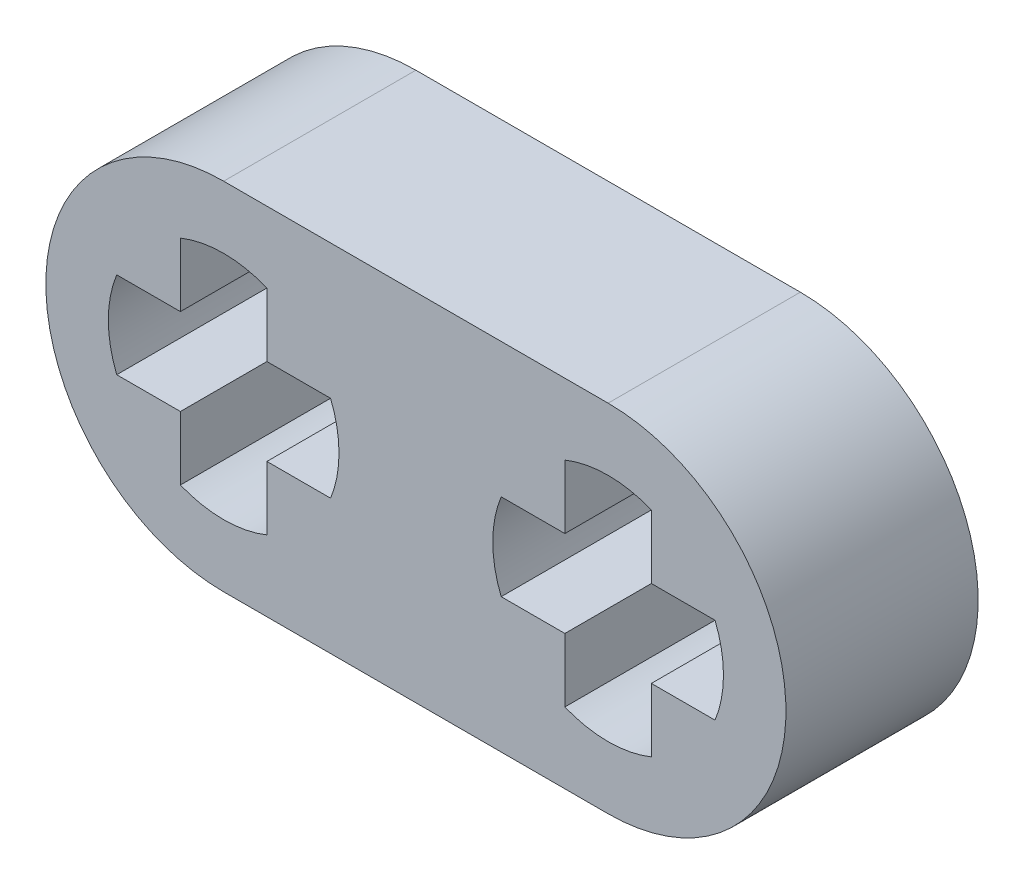
ISO-10303-21;
HEADER;
FILE_DESCRIPTION(('STEP AP214'),'2;1');
FILE_NAME('part.step','',(''),(''),'','','');
FILE_SCHEMA(('AUTOMOTIVE_DESIGN { 1 0 10303 214 1 1 1 1 }'));
ENDSEC;
DATA;
#1=APPLICATION_CONTEXT('core data for automotive mechanical design processes');
#2=APPLICATION_PROTOCOL_DEFINITION('international standard','automotive_design',2000,#1);
#3=PRODUCT_CONTEXT('',#1,'mechanical');
#4=PRODUCT('Part','Part','',(#3));
#5=PRODUCT_RELATED_PRODUCT_CATEGORY('part','',(#4));
#6=PRODUCT_DEFINITION_FORMATION('','',#4);
#7=PRODUCT_DEFINITION_CONTEXT('part definition',#1,'design');
#8=PRODUCT_DEFINITION('design','',#6,#7);
#9=PRODUCT_DEFINITION_SHAPE('','',#8);
#10=(LENGTH_UNIT() NAMED_UNIT(*) SI_UNIT(.MILLI.,.METRE.));
#11=(NAMED_UNIT(*) PLANE_ANGLE_UNIT() SI_UNIT($,.RADIAN.));
#12=(NAMED_UNIT(*) SI_UNIT($,.STERADIAN.) SOLID_ANGLE_UNIT());
#13=UNCERTAINTY_MEASURE_WITH_UNIT(LENGTH_MEASURE(1.E-05),#10,'distance_accuracy_value','');
#14=(GEOMETRIC_REPRESENTATION_CONTEXT(3) GLOBAL_UNCERTAINTY_ASSIGNED_CONTEXT((#13)) GLOBAL_UNIT_ASSIGNED_CONTEXT((#10,
#11,#12)) REPRESENTATION_CONTEXT('',''));
#15=CARTESIAN_POINT('',(0.,0.,0.));
#16=DIRECTION('',(0.,0.,1.));
#17=DIRECTION('',(1.,0.,0.));
#18=AXIS2_PLACEMENT_3D('',#15,#16,#17);
#19=CARTESIAN_POINT('',(0.,3.7,2.));
#20=DIRECTION('',(0.,-1.,0.));
#21=DIRECTION('',(1.,0.,0.));
#22=AXIS2_PLACEMENT_3D('',#19,#20,#21);
#23=PLANE('',#22);
#24=DIRECTION('',(-1.,0.,0.));
#25=VECTOR('',#24,1.);
#26=CARTESIAN_POINT('',(0.,3.7,-2.));
#27=LINE('',#26,#25);
#28=CARTESIAN_POINT('',(4.,3.7,-2.));
#29=VERTEX_POINT('',#28);
#30=CARTESIAN_POINT('',(-4.,3.7,-2.));
#31=VERTEX_POINT('',#30);
#32=EDGE_CURVE('E314',#29,#31,#27,.T.);
#33=ORIENTED_EDGE('',*,*,#32,.T.);
#34=DIRECTION('',(0.,0.,-1.));
#35=VECTOR('',#34,1.);
#36=CARTESIAN_POINT('',(-4.,3.7,2.));
#37=LINE('',#36,#35);
#38=CARTESIAN_POINT('',(-4.,3.7,2.));
#39=VERTEX_POINT('',#38);
#40=EDGE_CURVE('E11',#39,#31,#37,.T.);
#41=ORIENTED_EDGE('',*,*,#40,.F.);
#42=DIRECTION('',(-1.,0.,0.));
#43=VECTOR('',#42,1.);
#44=CARTESIAN_POINT('',(0.,3.7,2.));
#45=LINE('',#44,#43);
#46=CARTESIAN_POINT('',(4.,3.7,2.));
#47=VERTEX_POINT('',#46);
#48=EDGE_CURVE('E231',#47,#39,#45,.T.);
#49=ORIENTED_EDGE('',*,*,#48,.F.);
#50=DIRECTION('',(0.,0.,-1.));
#51=VECTOR('',#50,1.);
#52=CARTESIAN_POINT('',(4.,3.7,2.));
#53=LINE('',#52,#51);
#54=EDGE_CURVE('E322',#47,#29,#53,.T.);
#55=ORIENTED_EDGE('',*,*,#54,.T.);
#56=EDGE_LOOP('',(#33,#41,#49,#55));
#57=FACE_BOUND('',#56,.T.);
#58=ADVANCED_FACE('F34',(#57),#23,.F.);
#59=CARTESIAN_POINT('',(-4.,0.,2.));
#60=DIRECTION('',(0.,0.,-1.));
#61=DIRECTION('',(-1.,0.,0.));
#62=AXIS2_PLACEMENT_3D('',#59,#60,#61);
#63=CYLINDRICAL_SURFACE('',#62,3.7);
#64=CARTESIAN_POINT('',(-4.,0.,-2.));
#65=DIRECTION('',(0.,0.,1.));
#66=DIRECTION('',(1.,0.,0.));
#67=AXIS2_PLACEMENT_3D('',#64,#65,#66);
#68=CIRCLE('',#67,3.7);
#69=CARTESIAN_POINT('',(-4.,-3.7,-2.));
#70=VERTEX_POINT('',#69);
#71=EDGE_CURVE('E237',#31,#70,#68,.T.);
#72=ORIENTED_EDGE('',*,*,#71,.T.);
#73=DIRECTION('',(0.,0.,-1.));
#74=VECTOR('',#73,1.);
#75=CARTESIAN_POINT('',(-4.,-3.7,2.));
#76=LINE('',#75,#74);
#77=CARTESIAN_POINT('',(-4.,-3.7,2.));
#78=VERTEX_POINT('',#77);
#79=EDGE_CURVE('E44',#78,#70,#76,.T.);
#80=ORIENTED_EDGE('',*,*,#79,.F.);
#81=CARTESIAN_POINT('',(-4.,0.,2.));
#82=DIRECTION('',(0.,0.,1.));
#83=DIRECTION('',(1.,0.,0.));
#84=AXIS2_PLACEMENT_3D('',#81,#82,#83);
#85=CIRCLE('',#84,3.7);
#86=EDGE_CURVE('E225',#39,#78,#85,.T.);
#87=ORIENTED_EDGE('',*,*,#86,.F.);
#88=ORIENTED_EDGE('',*,*,#40,.T.);
#89=EDGE_LOOP('',(#72,#80,#87,#88));
#90=FACE_BOUND('',#89,.T.);
#91=ADVANCED_FACE('F236',(#90),#63,.T.);
#92=CARTESIAN_POINT('',(0.,-3.7,2.));
#93=DIRECTION('',(0.,-1.,0.));
#94=DIRECTION('',(1.,0.,0.));
#95=AXIS2_PLACEMENT_3D('',#92,#93,#94);
#96=PLANE('',#95);
#97=DIRECTION('',(-1.,0.,0.));
#98=VECTOR('',#97,1.);
#99=CARTESIAN_POINT('',(0.,-3.7,-2.));
#100=LINE('',#99,#98);
#101=CARTESIAN_POINT('',(4.,-3.7,-2.));
#102=VERTEX_POINT('',#101);
#103=EDGE_CURVE('E318',#102,#70,#100,.T.);
#104=ORIENTED_EDGE('',*,*,#103,.F.);
#105=DIRECTION('',(0.,0.,-1.));
#106=VECTOR('',#105,1.);
#107=CARTESIAN_POINT('',(4.,-3.7,2.));
#108=LINE('',#107,#106);
#109=CARTESIAN_POINT('',(4.,-3.7,2.));
#110=VERTEX_POINT('',#109);
#111=EDGE_CURVE('E141',#110,#102,#108,.T.);
#112=ORIENTED_EDGE('',*,*,#111,.F.);
#113=DIRECTION('',(-1.,0.,0.));
#114=VECTOR('',#113,1.);
#115=CARTESIAN_POINT('',(0.,-3.7,2.));
#116=LINE('',#115,#114);
#117=EDGE_CURVE('E229',#110,#78,#116,.T.);
#118=ORIENTED_EDGE('',*,*,#117,.T.);
#119=ORIENTED_EDGE('',*,*,#79,.T.);
#120=EDGE_LOOP('',(#104,#112,#118,#119));
#121=FACE_BOUND('',#120,.T.);
#122=ADVANCED_FACE('F242',(#121),#96,.T.);
#123=CARTESIAN_POINT('',(-4.,0.,2.));
#124=DIRECTION('',(0.,0.,-1.));
#125=DIRECTION('',(-1.,0.,0.));
#126=AXIS2_PLACEMENT_3D('',#123,#124,#125);
#127=CYLINDRICAL_SURFACE('',#126,2.4);
#128=CARTESIAN_POINT('',(-4.,0.,-2.));
#129=DIRECTION('',(0.,0.,1.));
#130=DIRECTION('',(1.,0.,0.));
#131=AXIS2_PLACEMENT_3D('',#128,#129,#130);
#132=CIRCLE('',#131,2.4);
#133=CARTESIAN_POINT('',(-1.7751404538713,0.900000000000001,-2.));
#134=VERTEX_POINT('',#133);
#135=CARTESIAN_POINT('',(-1.7751404538713,-0.899999999999999,-2.));
#136=VERTEX_POINT('',#135);
#137=EDGE_CURVE('E283',#134,#136,#132,.F.);
#138=ORIENTED_EDGE('',*,*,#137,.T.);
#139=DIRECTION('',(0.,0.,-1.));
#140=VECTOR('',#139,1.);
#141=CARTESIAN_POINT('',(-1.7751404538713,-0.899999999999999,2.));
#142=LINE('',#141,#140);
#143=CARTESIAN_POINT('',(-1.7751404538713,-0.899999999999999,2.));
#144=VERTEX_POINT('',#143);
#145=EDGE_CURVE('E324',#144,#136,#142,.T.);
#146=ORIENTED_EDGE('',*,*,#145,.F.);
#147=CARTESIAN_POINT('',(-4.,0.,2.));
#148=DIRECTION('',(0.,0.,1.));
#149=DIRECTION('',(1.,0.,0.));
#150=AXIS2_PLACEMENT_3D('',#147,#148,#149);
#151=CIRCLE('',#150,2.4);
#152=CARTESIAN_POINT('',(-1.7751404538713,0.900000000000001,2.));
#153=VERTEX_POINT('',#152);
#154=EDGE_CURVE('E425',#153,#144,#151,.F.);
#155=ORIENTED_EDGE('',*,*,#154,.F.);
#156=DIRECTION('',(0.,0.,-1.));
#157=VECTOR('',#156,1.);
#158=CARTESIAN_POINT('',(-1.7751404538713,0.900000000000001,2.));
#159=LINE('',#158,#157);
#160=EDGE_CURVE('E326',#153,#134,#159,.T.);
#161=ORIENTED_EDGE('',*,*,#160,.T.);
#162=EDGE_LOOP('',(#138,#146,#155,#161));
#163=FACE_BOUND('',#162,.T.);
#164=ADVANCED_FACE('F463',(#163),#127,.F.);
#165=CARTESIAN_POINT('',(0.,-0.899999999999999,2.));
#166=DIRECTION('',(0.,1.,0.));
#167=DIRECTION('',(-1.,0.,0.));
#168=AXIS2_PLACEMENT_3D('',#165,#166,#167);
#169=PLANE('',#168);
#170=DIRECTION('',(1.,0.,0.));
#171=VECTOR('',#170,1.);
#172=CARTESIAN_POINT('',(0.,-0.899999999999999,-2.));
#173=LINE('',#172,#171);
#174=CARTESIAN_POINT('',(-3.1,-0.9,-2.));
#175=VERTEX_POINT('',#174);
#176=EDGE_CURVE('E286',#175,#136,#173,.T.);
#177=ORIENTED_EDGE('',*,*,#176,.F.);
#178=DIRECTION('',(0.,0.,-1.));
#179=VECTOR('',#178,1.);
#180=CARTESIAN_POINT('',(-3.1,-0.9,2.));
#181=LINE('',#180,#179);
#182=CARTESIAN_POINT('',(-3.1,-0.9,2.));
#183=VERTEX_POINT('',#182);
#184=EDGE_CURVE('E351',#183,#175,#181,.T.);
#185=ORIENTED_EDGE('',*,*,#184,.F.);
#186=DIRECTION('',(1.,0.,0.));
#187=VECTOR('',#186,1.);
#188=CARTESIAN_POINT('',(0.,-0.899999999999999,2.));
#189=LINE('',#188,#187);
#190=EDGE_CURVE('E427',#183,#144,#189,.T.);
#191=ORIENTED_EDGE('',*,*,#190,.T.);
#192=ORIENTED_EDGE('',*,*,#145,.T.);
#193=EDGE_LOOP('',(#177,#185,#191,#192));
#194=FACE_BOUND('',#193,.T.);
#195=ADVANCED_FACE('F466',(#194),#169,.T.);
#196=CARTESIAN_POINT('',(-3.1,0.,2.));
#197=DIRECTION('',(-1.,0.,0.));
#198=DIRECTION('',(0.,-1.,0.));
#199=AXIS2_PLACEMENT_3D('',#196,#197,#198);
#200=PLANE('',#199);
#201=DIRECTION('',(0.,1.,0.));
#202=VECTOR('',#201,1.);
#203=CARTESIAN_POINT('',(-3.1,0.,-2.));
#204=LINE('',#203,#202);
#205=CARTESIAN_POINT('',(-3.1,-2.2248595461287,-2.));
#206=VERTEX_POINT('',#205);
#207=EDGE_CURVE('E289',#206,#175,#204,.T.);
#208=ORIENTED_EDGE('',*,*,#207,.F.);
#209=DIRECTION('',(0.,0.,-1.));
#210=VECTOR('',#209,1.);
#211=CARTESIAN_POINT('',(-3.1,-2.2248595461287,2.));
#212=LINE('',#211,#210);
#213=CARTESIAN_POINT('',(-3.1,-2.2248595461287,2.));
#214=VERTEX_POINT('',#213);
#215=EDGE_CURVE('E349',#214,#206,#212,.T.);
#216=ORIENTED_EDGE('',*,*,#215,.F.);
#217=DIRECTION('',(0.,1.,0.));
#218=VECTOR('',#217,1.);
#219=CARTESIAN_POINT('',(-3.1,0.,2.));
#220=LINE('',#219,#218);
#221=EDGE_CURVE('E430',#214,#183,#220,.T.);
#222=ORIENTED_EDGE('',*,*,#221,.T.);
#223=ORIENTED_EDGE('',*,*,#184,.T.);
#224=EDGE_LOOP('',(#208,#216,#222,#223));
#225=FACE_BOUND('',#224,.T.);
#226=ADVANCED_FACE('F470',(#225),#200,.T.);
#227=CARTESIAN_POINT('',(-4.,0.,2.));
#228=DIRECTION('',(0.,0.,-1.));
#229=DIRECTION('',(-1.,0.,0.));
#230=AXIS2_PLACEMENT_3D('',#227,#228,#229);
#231=CYLINDRICAL_SURFACE('',#230,2.4);
#232=CARTESIAN_POINT('',(-4.,0.,-2.));
#233=DIRECTION('',(0.,0.,1.));
#234=DIRECTION('',(1.,0.,0.));
#235=AXIS2_PLACEMENT_3D('',#232,#233,#234);
#236=CIRCLE('',#235,2.4);
#237=CARTESIAN_POINT('',(-4.9,-2.2248595461287,-2.));
#238=VERTEX_POINT('',#237);
#239=EDGE_CURVE('E292',#206,#238,#236,.F.);
#240=ORIENTED_EDGE('',*,*,#239,.T.);
#241=DIRECTION('',(0.,0.,-1.));
#242=VECTOR('',#241,1.);
#243=CARTESIAN_POINT('',(-4.9,-2.2248595461287,2.));
#244=LINE('',#243,#242);
#245=CARTESIAN_POINT('',(-4.9,-2.2248595461287,2.));
#246=VERTEX_POINT('',#245);
#247=EDGE_CURVE('E346',#246,#238,#244,.T.);
#248=ORIENTED_EDGE('',*,*,#247,.F.);
#249=CARTESIAN_POINT('',(-4.,0.,2.));
#250=DIRECTION('',(0.,0.,1.));
#251=DIRECTION('',(1.,0.,0.));
#252=AXIS2_PLACEMENT_3D('',#249,#250,#251);
#253=CIRCLE('',#252,2.4);
#254=EDGE_CURVE('E433',#214,#246,#253,.F.);
#255=ORIENTED_EDGE('',*,*,#254,.F.);
#256=ORIENTED_EDGE('',*,*,#215,.T.);
#257=EDGE_LOOP('',(#240,#248,#255,#256));
#258=FACE_BOUND('',#257,.T.);
#259=ADVANCED_FACE('F475',(#258),#231,.F.);
#260=CARTESIAN_POINT('',(-4.9,0.,2.));
#261=DIRECTION('',(-1.,0.,0.));
#262=DIRECTION('',(0.,-1.,0.));
#263=AXIS2_PLACEMENT_3D('',#260,#261,#262);
#264=PLANE('',#263);
#265=DIRECTION('',(0.,1.,0.));
#266=VECTOR('',#265,1.);
#267=CARTESIAN_POINT('',(-4.9,0.,-2.));
#268=LINE('',#267,#266);
#269=CARTESIAN_POINT('',(-4.9,-0.900000000000001,-2.));
#270=VERTEX_POINT('',#269);
#271=EDGE_CURVE('E294',#238,#270,#268,.T.);
#272=ORIENTED_EDGE('',*,*,#271,.T.);
#273=DIRECTION('',(0.,0.,-1.));
#274=VECTOR('',#273,1.);
#275=CARTESIAN_POINT('',(-4.9,-0.900000000000001,2.));
#276=LINE('',#275,#274);
#277=CARTESIAN_POINT('',(-4.9,-0.900000000000001,2.));
#278=VERTEX_POINT('',#277);
#279=EDGE_CURVE('E344',#278,#270,#276,.T.);
#280=ORIENTED_EDGE('',*,*,#279,.F.);
#281=DIRECTION('',(0.,1.,0.));
#282=VECTOR('',#281,1.);
#283=CARTESIAN_POINT('',(-4.9,0.,2.));
#284=LINE('',#283,#282);
#285=EDGE_CURVE('E435',#246,#278,#284,.T.);
#286=ORIENTED_EDGE('',*,*,#285,.F.);
#287=ORIENTED_EDGE('',*,*,#247,.T.);
#288=EDGE_LOOP('',(#272,#280,#286,#287));
#289=FACE_BOUND('',#288,.T.);
#290=ADVANCED_FACE('F480',(#289),#264,.F.);
#291=CARTESIAN_POINT('',(0.,-0.899999999999999,2.));
#292=DIRECTION('',(0.,1.,0.));
#293=DIRECTION('',(-1.,0.,0.));
#294=AXIS2_PLACEMENT_3D('',#291,#292,#293);
#295=PLANE('',#294);
#296=DIRECTION('',(1.,0.,0.));
#297=VECTOR('',#296,1.);
#298=CARTESIAN_POINT('',(0.,-0.899999999999999,-2.));
#299=LINE('',#298,#297);
#300=CARTESIAN_POINT('',(-6.2248595461287,-0.900000000000002,-2.));
#301=VERTEX_POINT('',#300);
#302=EDGE_CURVE('E297',#301,#270,#299,.T.);
#303=ORIENTED_EDGE('',*,*,#302,.F.);
#304=DIRECTION('',(0.,0.,-1.));
#305=VECTOR('',#304,1.);
#306=CARTESIAN_POINT('',(-6.2248595461287,-0.900000000000002,2.));
#307=LINE('',#306,#305);
#308=CARTESIAN_POINT('',(-6.2248595461287,-0.900000000000002,2.));
#309=VERTEX_POINT('',#308);
#310=EDGE_CURVE('E342',#309,#301,#307,.T.);
#311=ORIENTED_EDGE('',*,*,#310,.F.);
#312=DIRECTION('',(1.,0.,0.));
#313=VECTOR('',#312,1.);
#314=CARTESIAN_POINT('',(0.,-0.899999999999999,2.));
#315=LINE('',#314,#313);
#316=EDGE_CURVE('E437',#309,#278,#315,.T.);
#317=ORIENTED_EDGE('',*,*,#316,.T.);
#318=ORIENTED_EDGE('',*,*,#279,.T.);
#319=EDGE_LOOP('',(#303,#311,#317,#318));
#320=FACE_BOUND('',#319,.T.);
#321=ADVANCED_FACE('F484',(#320),#295,.T.);
#322=CARTESIAN_POINT('',(-4.,0.,2.));
#323=DIRECTION('',(0.,0.,-1.));
#324=DIRECTION('',(-1.,0.,0.));
#325=AXIS2_PLACEMENT_3D('',#322,#323,#324);
#326=CYLINDRICAL_SURFACE('',#325,2.4);
#327=CARTESIAN_POINT('',(-4.,0.,-2.));
#328=DIRECTION('',(0.,0.,1.));
#329=DIRECTION('',(1.,0.,0.));
#330=AXIS2_PLACEMENT_3D('',#327,#328,#329);
#331=CIRCLE('',#330,2.4);
#332=CARTESIAN_POINT('',(-6.2248595461287,0.899999999999998,-2.));
#333=VERTEX_POINT('',#332);
#334=EDGE_CURVE('E300',#301,#333,#331,.F.);
#335=ORIENTED_EDGE('',*,*,#334,.T.);
#336=DIRECTION('',(0.,0.,-1.));
#337=VECTOR('',#336,1.);
#338=CARTESIAN_POINT('',(-6.2248595461287,0.899999999999998,2.));
#339=LINE('',#338,#337);
#340=CARTESIAN_POINT('',(-6.2248595461287,0.899999999999998,2.));
#341=VERTEX_POINT('',#340);
#342=EDGE_CURVE('E339',#341,#333,#339,.T.);
#343=ORIENTED_EDGE('',*,*,#342,.F.);
#344=CARTESIAN_POINT('',(-4.,0.,2.));
#345=DIRECTION('',(0.,0.,1.));
#346=DIRECTION('',(1.,0.,0.));
#347=AXIS2_PLACEMENT_3D('',#344,#345,#346);
#348=CIRCLE('',#347,2.4);
#349=EDGE_CURVE('E440',#309,#341,#348,.F.);
#350=ORIENTED_EDGE('',*,*,#349,.F.);
#351=ORIENTED_EDGE('',*,*,#310,.T.);
#352=EDGE_LOOP('',(#335,#343,#350,#351));
#353=FACE_BOUND('',#352,.T.);
#354=ADVANCED_FACE('F489',(#353),#326,.F.);
#355=CARTESIAN_POINT('',(0.,0.900000000000001,2.));
#356=DIRECTION('',(0.,1.,0.));
#357=DIRECTION('',(-1.,0.,0.));
#358=AXIS2_PLACEMENT_3D('',#355,#356,#357);
#359=PLANE('',#358);
#360=DIRECTION('',(1.,0.,0.));
#361=VECTOR('',#360,1.);
#362=CARTESIAN_POINT('',(0.,0.900000000000001,-2.));
#363=LINE('',#362,#361);
#364=CARTESIAN_POINT('',(-4.9,0.899999999999999,-2.));
#365=VERTEX_POINT('',#364);
#366=EDGE_CURVE('E302',#333,#365,#363,.T.);
#367=ORIENTED_EDGE('',*,*,#366,.T.);
#368=DIRECTION('',(0.,0.,-1.));
#369=VECTOR('',#368,1.);
#370=CARTESIAN_POINT('',(-4.9,0.899999999999999,2.));
#371=LINE('',#370,#369);
#372=CARTESIAN_POINT('',(-4.9,0.899999999999999,2.));
#373=VERTEX_POINT('',#372);
#374=EDGE_CURVE('E336',#373,#365,#371,.T.);
#375=ORIENTED_EDGE('',*,*,#374,.F.);
#376=DIRECTION('',(1.,0.,0.));
#377=VECTOR('',#376,1.);
#378=CARTESIAN_POINT('',(0.,0.900000000000001,2.));
#379=LINE('',#378,#377);
#380=EDGE_CURVE('E442',#341,#373,#379,.T.);
#381=ORIENTED_EDGE('',*,*,#380,.F.);
#382=ORIENTED_EDGE('',*,*,#342,.T.);
#383=EDGE_LOOP('',(#367,#375,#381,#382));
#384=FACE_BOUND('',#383,.T.);
#385=ADVANCED_FACE('F495',(#384),#359,.F.);
#386=CARTESIAN_POINT('',(-4.9,0.,2.));
#387=DIRECTION('',(-1.,0.,0.));
#388=DIRECTION('',(0.,-1.,0.));
#389=AXIS2_PLACEMENT_3D('',#386,#387,#388);
#390=PLANE('',#389);
#391=DIRECTION('',(0.,1.,0.));
#392=VECTOR('',#391,1.);
#393=CARTESIAN_POINT('',(-4.9,0.,-2.));
#394=LINE('',#393,#392);
#395=CARTESIAN_POINT('',(-4.9,2.2248595461287,-2.));
#396=VERTEX_POINT('',#395);
#397=EDGE_CURVE('E304',#365,#396,#394,.T.);
#398=ORIENTED_EDGE('',*,*,#397,.T.);
#399=DIRECTION('',(0.,0.,-1.));
#400=VECTOR('',#399,1.);
#401=CARTESIAN_POINT('',(-4.9,2.2248595461287,2.));
#402=LINE('',#401,#400);
#403=CARTESIAN_POINT('',(-4.9,2.2248595461287,2.));
#404=VERTEX_POINT('',#403);
#405=EDGE_CURVE('E333',#404,#396,#402,.T.);
#406=ORIENTED_EDGE('',*,*,#405,.F.);
#407=DIRECTION('',(0.,1.,0.));
#408=VECTOR('',#407,1.);
#409=CARTESIAN_POINT('',(-4.9,0.,2.));
#410=LINE('',#409,#408);
#411=EDGE_CURVE('E444',#373,#404,#410,.T.);
#412=ORIENTED_EDGE('',*,*,#411,.F.);
#413=ORIENTED_EDGE('',*,*,#374,.T.);
#414=EDGE_LOOP('',(#398,#406,#412,#413));
#415=FACE_BOUND('',#414,.T.);
#416=ADVANCED_FACE('F499',(#415),#390,.F.);
#417=CARTESIAN_POINT('',(-4.,0.,2.));
#418=DIRECTION('',(0.,0.,-1.));
#419=DIRECTION('',(-1.,0.,0.));
#420=AXIS2_PLACEMENT_3D('',#417,#418,#419);
#421=CYLINDRICAL_SURFACE('',#420,2.4);
#422=CARTESIAN_POINT('',(-4.,0.,-2.));
#423=DIRECTION('',(0.,0.,1.));
#424=DIRECTION('',(1.,0.,0.));
#425=AXIS2_PLACEMENT_3D('',#422,#423,#424);
#426=CIRCLE('',#425,2.4);
#427=CARTESIAN_POINT('',(-3.1,2.2248595461287,-2.));
#428=VERTEX_POINT('',#427);
#429=EDGE_CURVE('E306',#396,#428,#426,.F.);
#430=ORIENTED_EDGE('',*,*,#429,.T.);
#431=DIRECTION('',(0.,0.,-1.));
#432=VECTOR('',#431,1.);
#433=CARTESIAN_POINT('',(-3.1,2.2248595461287,2.));
#434=LINE('',#433,#432);
#435=CARTESIAN_POINT('',(-3.1,2.2248595461287,2.));
#436=VERTEX_POINT('',#435);
#437=EDGE_CURVE('E331',#436,#428,#434,.T.);
#438=ORIENTED_EDGE('',*,*,#437,.F.);
#439=CARTESIAN_POINT('',(-4.,0.,2.));
#440=DIRECTION('',(0.,0.,1.));
#441=DIRECTION('',(1.,0.,0.));
#442=AXIS2_PLACEMENT_3D('',#439,#440,#441);
#443=CIRCLE('',#442,2.4);
#444=EDGE_CURVE('E446',#404,#436,#443,.F.);
#445=ORIENTED_EDGE('',*,*,#444,.F.);
#446=ORIENTED_EDGE('',*,*,#405,.T.);
#447=EDGE_LOOP('',(#430,#438,#445,#446));
#448=FACE_BOUND('',#447,.T.);
#449=ADVANCED_FACE('F504',(#448),#421,.F.);
#450=CARTESIAN_POINT('',(-3.1,0.,2.));
#451=DIRECTION('',(-1.,0.,0.));
#452=DIRECTION('',(0.,-1.,0.));
#453=AXIS2_PLACEMENT_3D('',#450,#451,#452);
#454=PLANE('',#453);
#455=DIRECTION('',(0.,1.,0.));
#456=VECTOR('',#455,1.);
#457=CARTESIAN_POINT('',(-3.1,0.,-2.));
#458=LINE('',#457,#456);
#459=CARTESIAN_POINT('',(-3.1,0.9,-2.));
#460=VERTEX_POINT('',#459);
#461=EDGE_CURVE('E309',#460,#428,#458,.T.);
#462=ORIENTED_EDGE('',*,*,#461,.F.);
#463=DIRECTION('',(0.,0.,-1.));
#464=VECTOR('',#463,1.);
#465=CARTESIAN_POINT('',(-3.1,0.9,2.));
#466=LINE('',#465,#464);
#467=CARTESIAN_POINT('',(-3.1,0.9,2.));
#468=VERTEX_POINT('',#467);
#469=EDGE_CURVE('E329',#468,#460,#466,.T.);
#470=ORIENTED_EDGE('',*,*,#469,.F.);
#471=DIRECTION('',(0.,1.,0.));
#472=VECTOR('',#471,1.);
#473=CARTESIAN_POINT('',(-3.1,0.,2.));
#474=LINE('',#473,#472);
#475=EDGE_CURVE('E448',#468,#436,#474,.T.);
#476=ORIENTED_EDGE('',*,*,#475,.T.);
#477=ORIENTED_EDGE('',*,*,#437,.T.);
#478=EDGE_LOOP('',(#462,#470,#476,#477));
#479=FACE_BOUND('',#478,.T.);
#480=ADVANCED_FACE('F507',(#479),#454,.T.);
#481=CARTESIAN_POINT('',(4.,0.,2.));
#482=DIRECTION('',(0.,0.,-1.));
#483=DIRECTION('',(-1.,0.,0.));
#484=AXIS2_PLACEMENT_3D('',#481,#482,#483);
#485=CYLINDRICAL_SURFACE('',#484,2.4);
#486=CARTESIAN_POINT('',(4.,0.,-2.));
#487=DIRECTION('',(0.,0.,1.));
#488=DIRECTION('',(1.,0.,0.));
#489=AXIS2_PLACEMENT_3D('',#486,#487,#488);
#490=CIRCLE('',#489,2.4);
#491=CARTESIAN_POINT('',(4.9,2.2248595461287,-2.));
#492=VERTEX_POINT('',#491);
#493=CARTESIAN_POINT('',(3.1,2.2248595461287,-2.));
#494=VERTEX_POINT('',#493);
#495=EDGE_CURVE('E248',#492,#494,#490,.T.);
#496=ORIENTED_EDGE('',*,*,#495,.F.);
#497=DIRECTION('',(0.,0.,-1.));
#498=VECTOR('',#497,1.);
#499=CARTESIAN_POINT('',(4.9,2.2248595461287,2.));
#500=LINE('',#499,#498);
#501=CARTESIAN_POINT('',(4.9,2.2248595461287,2.));
#502=VERTEX_POINT('',#501);
#503=EDGE_CURVE('E38',#502,#492,#500,.T.);
#504=ORIENTED_EDGE('',*,*,#503,.F.);
#505=CARTESIAN_POINT('',(4.,0.,2.));
#506=DIRECTION('',(0.,0.,1.));
#507=DIRECTION('',(1.,0.,0.));
#508=AXIS2_PLACEMENT_3D('',#505,#506,#507);
#509=CIRCLE('',#508,2.4);
#510=CARTESIAN_POINT('',(3.1,2.2248595461287,2.));
#511=VERTEX_POINT('',#510);
#512=EDGE_CURVE('E321',#502,#511,#509,.T.);
#513=ORIENTED_EDGE('',*,*,#512,.T.);
#514=DIRECTION('',(0.,0.,-1.));
#515=VECTOR('',#514,1.);
#516=CARTESIAN_POINT('',(3.1,2.2248595461287,2.));
#517=LINE('',#516,#515);
#518=EDGE_CURVE('E244',#511,#494,#517,.T.);
#519=ORIENTED_EDGE('',*,*,#518,.T.);
#520=EDGE_LOOP('',(#496,#504,#513,#519));
#521=FACE_BOUND('',#520,.T.);
#522=ADVANCED_FACE('F36',(#521),#485,.F.);
#523=CARTESIAN_POINT('',(4.9,0.,2.));
#524=DIRECTION('',(-1.,0.,0.));
#525=DIRECTION('',(0.,0.,1.));
#526=AXIS2_PLACEMENT_3D('',#523,#524,#525);
#527=PLANE('',#526);
#528=DIRECTION('',(0.,1.,0.));
#529=VECTOR('',#528,1.);
#530=CARTESIAN_POINT('',(4.9,0.,-2.));
#531=LINE('',#530,#529);
#532=CARTESIAN_POINT('',(4.9,0.900000000000001,-2.));
#533=VERTEX_POINT('',#532);
#534=EDGE_CURVE('E251',#533,#492,#531,.T.);
#535=ORIENTED_EDGE('',*,*,#534,.F.);
#536=DIRECTION('',(0.,0.,-1.));
#537=VECTOR('',#536,1.);
#538=CARTESIAN_POINT('',(4.9,0.900000000000001,2.));
#539=LINE('',#538,#537);
#540=CARTESIAN_POINT('',(4.9,0.900000000000001,2.));
#541=VERTEX_POINT('',#540);
#542=EDGE_CURVE('E373',#541,#533,#539,.T.);
#543=ORIENTED_EDGE('',*,*,#542,.F.);
#544=DIRECTION('',(0.,1.,0.));
#545=VECTOR('',#544,1.);
#546=CARTESIAN_POINT('',(4.9,0.,2.));
#547=LINE('',#546,#545);
#548=EDGE_CURVE('E382',#541,#502,#547,.T.);
#549=ORIENTED_EDGE('',*,*,#548,.T.);
#550=ORIENTED_EDGE('',*,*,#503,.T.);
#551=EDGE_LOOP('',(#535,#543,#549,#550));
#552=FACE_BOUND('',#551,.T.);
#553=ADVANCED_FACE('F380',(#552),#527,.T.);
#554=CARTESIAN_POINT('',(0.,0.900000000000001,2.));
#555=DIRECTION('',(0.,-1.,0.));
#556=DIRECTION('',(1.,0.,0.));
#557=AXIS2_PLACEMENT_3D('',#554,#555,#556);
#558=PLANE('',#557);
#559=DIRECTION('',(-1.,0.,0.));
#560=VECTOR('',#559,1.);
#561=CARTESIAN_POINT('',(0.,0.900000000000001,-2.));
#562=LINE('',#561,#560);
#563=CARTESIAN_POINT('',(6.2248595461287,0.900000000000001,-2.));
#564=VERTEX_POINT('',#563);
#565=EDGE_CURVE('E254',#564,#533,#562,.T.);
#566=ORIENTED_EDGE('',*,*,#565,.F.);
#567=DIRECTION('',(0.,0.,-1.));
#568=VECTOR('',#567,1.);
#569=CARTESIAN_POINT('',(6.2248595461287,0.900000000000001,2.));
#570=LINE('',#569,#568);
#571=CARTESIAN_POINT('',(6.2248595461287,0.900000000000001,2.));
#572=VERTEX_POINT('',#571);
#573=EDGE_CURVE('E372',#572,#564,#570,.T.);
#574=ORIENTED_EDGE('',*,*,#573,.F.);
#575=DIRECTION('',(-1.,0.,0.));
#576=VECTOR('',#575,1.);
#577=CARTESIAN_POINT('',(0.,0.900000000000001,2.));
#578=LINE('',#577,#576);
#579=EDGE_CURVE('E392',#572,#541,#578,.T.);
#580=ORIENTED_EDGE('',*,*,#579,.T.);
#581=ORIENTED_EDGE('',*,*,#542,.T.);
#582=EDGE_LOOP('',(#566,#574,#580,#581));
#583=FACE_BOUND('',#582,.T.);
#584=ADVANCED_FACE('F390',(#583),#558,.T.);
#585=CARTESIAN_POINT('',(4.,0.,2.));
#586=DIRECTION('',(0.,0.,-1.));
#587=DIRECTION('',(-1.,0.,0.));
#588=AXIS2_PLACEMENT_3D('',#585,#586,#587);
#589=CYLINDRICAL_SURFACE('',#588,2.4);
#590=CARTESIAN_POINT('',(4.,0.,-2.));
#591=DIRECTION('',(0.,0.,1.));
#592=DIRECTION('',(1.,0.,0.));
#593=AXIS2_PLACEMENT_3D('',#590,#591,#592);
#594=CIRCLE('',#593,2.4);
#595=CARTESIAN_POINT('',(6.2248595461287,-0.899999999999999,-2.));
#596=VERTEX_POINT('',#595);
#597=EDGE_CURVE('E257',#596,#564,#594,.T.);
#598=ORIENTED_EDGE('',*,*,#597,.F.);
#599=DIRECTION('',(0.,0.,-1.));
#600=VECTOR('',#599,1.);
#601=CARTESIAN_POINT('',(6.2248595461287,-0.899999999999999,2.));
#602=LINE('',#601,#600);
#603=CARTESIAN_POINT('',(6.2248595461287,-0.899999999999999,2.));
#604=VERTEX_POINT('',#603);
#605=EDGE_CURVE('E370',#604,#596,#602,.T.);
#606=ORIENTED_EDGE('',*,*,#605,.F.);
#607=CARTESIAN_POINT('',(4.,0.,2.));
#608=DIRECTION('',(0.,0.,1.));
#609=DIRECTION('',(1.,0.,0.));
#610=AXIS2_PLACEMENT_3D('',#607,#608,#609);
#611=CIRCLE('',#610,2.4);
#612=EDGE_CURVE('E398',#604,#572,#611,.T.);
#613=ORIENTED_EDGE('',*,*,#612,.T.);
#614=ORIENTED_EDGE('',*,*,#573,.T.);
#615=EDGE_LOOP('',(#598,#606,#613,#614));
#616=FACE_BOUND('',#615,.T.);
#617=ADVANCED_FACE('F400',(#616),#589,.F.);
#618=CARTESIAN_POINT('',(0.,-0.899999999999999,2.));
#619=DIRECTION('',(0.,-1.,0.));
#620=DIRECTION('',(0.,0.,-1.));
#621=AXIS2_PLACEMENT_3D('',#618,#619,#620);
#622=PLANE('',#621);
#623=DIRECTION('',(-1.,0.,0.));
#624=VECTOR('',#623,1.);
#625=CARTESIAN_POINT('',(0.,-0.899999999999999,-2.));
#626=LINE('',#625,#624);
#627=CARTESIAN_POINT('',(4.9,-0.899999999999999,-2.));
#628=VERTEX_POINT('',#627);
#629=EDGE_CURVE('E260',#596,#628,#626,.T.);
#630=ORIENTED_EDGE('',*,*,#629,.T.);
#631=DIRECTION('',(0.,0.,-1.));
#632=VECTOR('',#631,1.);
#633=CARTESIAN_POINT('',(4.9,-0.899999999999999,2.));
#634=LINE('',#633,#632);
#635=CARTESIAN_POINT('',(4.9,-0.899999999999999,2.));
#636=VERTEX_POINT('',#635);
#637=EDGE_CURVE('E368',#636,#628,#634,.T.);
#638=ORIENTED_EDGE('',*,*,#637,.F.);
#639=DIRECTION('',(-1.,0.,0.));
#640=VECTOR('',#639,1.);
#641=CARTESIAN_POINT('',(0.,-0.899999999999999,2.));
#642=LINE('',#641,#640);
#643=EDGE_CURVE('E402',#604,#636,#642,.T.);
#644=ORIENTED_EDGE('',*,*,#643,.F.);
#645=ORIENTED_EDGE('',*,*,#605,.T.);
#646=EDGE_LOOP('',(#630,#638,#644,#645));
#647=FACE_BOUND('',#646,.T.);
#648=ADVANCED_FACE('F579',(#647),#622,.F.);
#649=CARTESIAN_POINT('',(4.9,0.,2.));
#650=DIRECTION('',(-1.,0.,0.));
#651=DIRECTION('',(0.,0.,1.));
#652=AXIS2_PLACEMENT_3D('',#649,#650,#651);
#653=PLANE('',#652);
#654=DIRECTION('',(0.,1.,0.));
#655=VECTOR('',#654,1.);
#656=CARTESIAN_POINT('',(4.9,0.,-2.));
#657=LINE('',#656,#655);
#658=CARTESIAN_POINT('',(4.9,-2.2248595461287,-2.));
#659=VERTEX_POINT('',#658);
#660=EDGE_CURVE('E263',#659,#628,#657,.T.);
#661=ORIENTED_EDGE('',*,*,#660,.F.);
#662=DIRECTION('',(0.,0.,-1.));
#663=VECTOR('',#662,1.);
#664=CARTESIAN_POINT('',(4.9,-2.2248595461287,2.));
#665=LINE('',#664,#663);
#666=CARTESIAN_POINT('',(4.9,-2.2248595461287,2.));
#667=VERTEX_POINT('',#666);
#668=EDGE_CURVE('E366',#667,#659,#665,.T.);
#669=ORIENTED_EDGE('',*,*,#668,.F.);
#670=DIRECTION('',(0.,1.,0.));
#671=VECTOR('',#670,1.);
#672=CARTESIAN_POINT('',(4.9,0.,2.));
#673=LINE('',#672,#671);
#674=EDGE_CURVE('E404',#667,#636,#673,.T.);
#675=ORIENTED_EDGE('',*,*,#674,.T.);
#676=ORIENTED_EDGE('',*,*,#637,.T.);
#677=EDGE_LOOP('',(#661,#669,#675,#676));
#678=FACE_BOUND('',#677,.T.);
#679=ADVANCED_FACE('F575',(#678),#653,.T.);
#680=CARTESIAN_POINT('',(4.,0.,2.));
#681=DIRECTION('',(0.,0.,-1.));
#682=DIRECTION('',(-1.,0.,0.));
#683=AXIS2_PLACEMENT_3D('',#680,#681,#682);
#684=CYLINDRICAL_SURFACE('',#683,2.4);
#685=CARTESIAN_POINT('',(4.,0.,-2.));
#686=DIRECTION('',(0.,0.,1.));
#687=DIRECTION('',(1.,0.,0.));
#688=AXIS2_PLACEMENT_3D('',#685,#686,#687);
#689=CIRCLE('',#688,2.4);
#690=CARTESIAN_POINT('',(3.1,-2.2248595461287,-2.));
#691=VERTEX_POINT('',#690);
#692=EDGE_CURVE('E266',#691,#659,#689,.T.);
#693=ORIENTED_EDGE('',*,*,#692,.F.);
#694=DIRECTION('',(0.,0.,-1.));
#695=VECTOR('',#694,1.);
#696=CARTESIAN_POINT('',(3.1,-2.2248595461287,2.));
#697=LINE('',#696,#695);
#698=CARTESIAN_POINT('',(3.1,-2.2248595461287,2.));
#699=VERTEX_POINT('',#698);
#700=EDGE_CURVE('E364',#699,#691,#697,.T.);
#701=ORIENTED_EDGE('',*,*,#700,.F.);
#702=CARTESIAN_POINT('',(4.,0.,2.));
#703=DIRECTION('',(0.,0.,1.));
#704=DIRECTION('',(1.,0.,0.));
#705=AXIS2_PLACEMENT_3D('',#702,#703,#704);
#706=CIRCLE('',#705,2.4);
#707=EDGE_CURVE('E410',#699,#667,#706,.T.);
#708=ORIENTED_EDGE('',*,*,#707,.T.);
#709=ORIENTED_EDGE('',*,*,#668,.T.);
#710=EDGE_LOOP('',(#693,#701,#708,#709));
#711=FACE_BOUND('',#710,.T.);
#712=ADVANCED_FACE('F571',(#711),#684,.F.);
#713=CARTESIAN_POINT('',(3.1,0.,2.));
#714=DIRECTION('',(-1.,0.,0.));
#715=DIRECTION('',(0.,0.,1.));
#716=AXIS2_PLACEMENT_3D('',#713,#714,#715);
#717=PLANE('',#716);
#718=DIRECTION('',(0.,1.,0.));
#719=VECTOR('',#718,1.);
#720=CARTESIAN_POINT('',(3.1,0.,-2.));
#721=LINE('',#720,#719);
#722=CARTESIAN_POINT('',(3.1,-0.899999999999999,-2.));
#723=VERTEX_POINT('',#722);
#724=EDGE_CURVE('E269',#691,#723,#721,.T.);
#725=ORIENTED_EDGE('',*,*,#724,.T.);
#726=DIRECTION('',(0.,0.,-1.));
#727=VECTOR('',#726,1.);
#728=CARTESIAN_POINT('',(3.1,-0.899999999999999,2.));
#729=LINE('',#728,#727);
#730=CARTESIAN_POINT('',(3.1,-0.899999999999999,2.));
#731=VERTEX_POINT('',#730);
#732=EDGE_CURVE('E361',#731,#723,#729,.T.);
#733=ORIENTED_EDGE('',*,*,#732,.F.);
#734=DIRECTION('',(0.,1.,0.));
#735=VECTOR('',#734,1.);
#736=CARTESIAN_POINT('',(3.1,0.,2.));
#737=LINE('',#736,#735);
#738=EDGE_CURVE('E413',#699,#731,#737,.T.);
#739=ORIENTED_EDGE('',*,*,#738,.F.);
#740=ORIENTED_EDGE('',*,*,#700,.T.);
#741=EDGE_LOOP('',(#725,#733,#739,#740));
#742=FACE_BOUND('',#741,.T.);
#743=ADVANCED_FACE('F567',(#742),#717,.F.);
#744=CARTESIAN_POINT('',(0.,-0.899999999999999,2.));
#745=DIRECTION('',(0.,-1.,0.));
#746=DIRECTION('',(0.,0.,-1.));
#747=AXIS2_PLACEMENT_3D('',#744,#745,#746);
#748=PLANE('',#747);
#749=DIRECTION('',(-1.,0.,0.));
#750=VECTOR('',#749,1.);
#751=CARTESIAN_POINT('',(0.,-0.899999999999999,-2.));
#752=LINE('',#751,#750);
#753=CARTESIAN_POINT('',(1.7751404538713,-0.899999999999999,-2.));
#754=VERTEX_POINT('',#753);
#755=EDGE_CURVE('E271',#723,#754,#752,.T.);
#756=ORIENTED_EDGE('',*,*,#755,.T.);
#757=DIRECTION('',(0.,0.,-1.));
#758=VECTOR('',#757,1.);
#759=CARTESIAN_POINT('',(1.7751404538713,-0.899999999999999,2.));
#760=LINE('',#759,#758);
#761=CARTESIAN_POINT('',(1.7751404538713,-0.899999999999999,2.));
#762=VERTEX_POINT('',#761);
#763=EDGE_CURVE('E359',#762,#754,#760,.T.);
#764=ORIENTED_EDGE('',*,*,#763,.F.);
#765=DIRECTION('',(-1.,0.,0.));
#766=VECTOR('',#765,1.);
#767=CARTESIAN_POINT('',(0.,-0.899999999999999,2.));
#768=LINE('',#767,#766);
#769=EDGE_CURVE('E415',#731,#762,#768,.T.);
#770=ORIENTED_EDGE('',*,*,#769,.F.);
#771=ORIENTED_EDGE('',*,*,#732,.T.);
#772=EDGE_LOOP('',(#756,#764,#770,#771));
#773=FACE_BOUND('',#772,.T.);
#774=ADVANCED_FACE('F563',(#773),#748,.F.);
#775=CARTESIAN_POINT('',(4.,0.,2.));
#776=DIRECTION('',(0.,0.,-1.));
#777=DIRECTION('',(-1.,0.,0.));
#778=AXIS2_PLACEMENT_3D('',#775,#776,#777);
#779=CYLINDRICAL_SURFACE('',#778,2.4);
#780=CARTESIAN_POINT('',(4.,0.,-2.));
#781=DIRECTION('',(0.,0.,1.));
#782=DIRECTION('',(1.,0.,0.));
#783=AXIS2_PLACEMENT_3D('',#780,#781,#782);
#784=CIRCLE('',#783,2.4);
#785=CARTESIAN_POINT('',(1.7751404538713,0.900000000000001,-2.));
#786=VERTEX_POINT('',#785);
#787=EDGE_CURVE('E274',#786,#754,#784,.T.);
#788=ORIENTED_EDGE('',*,*,#787,.F.);
#789=DIRECTION('',(0.,0.,-1.));
#790=VECTOR('',#789,1.);
#791=CARTESIAN_POINT('',(1.7751404538713,0.900000000000001,2.));
#792=LINE('',#791,#790);
#793=CARTESIAN_POINT('',(1.7751404538713,0.900000000000001,2.));
#794=VERTEX_POINT('',#793);
#795=EDGE_CURVE('E357',#794,#786,#792,.T.);
#796=ORIENTED_EDGE('',*,*,#795,.F.);
#797=CARTESIAN_POINT('',(4.,0.,2.));
#798=DIRECTION('',(0.,0.,1.));
#799=DIRECTION('',(1.,0.,0.));
#800=AXIS2_PLACEMENT_3D('',#797,#798,#799);
#801=CIRCLE('',#800,2.4);
#802=EDGE_CURVE('E417',#794,#762,#801,.T.);
#803=ORIENTED_EDGE('',*,*,#802,.T.);
#804=ORIENTED_EDGE('',*,*,#763,.T.);
#805=EDGE_LOOP('',(#788,#796,#803,#804));
#806=FACE_BOUND('',#805,.T.);
#807=ADVANCED_FACE('F559',(#806),#779,.F.);
#808=CARTESIAN_POINT('',(0.,0.900000000000001,2.));
#809=DIRECTION('',(0.,-1.,0.));
#810=DIRECTION('',(1.,0.,0.));
#811=AXIS2_PLACEMENT_3D('',#808,#809,#810);
#812=PLANE('',#811);
#813=DIRECTION('',(-1.,0.,0.));
#814=VECTOR('',#813,1.);
#815=CARTESIAN_POINT('',(0.,0.900000000000001,-2.));
#816=LINE('',#815,#814);
#817=CARTESIAN_POINT('',(3.1,0.900000000000001,-2.));
#818=VERTEX_POINT('',#817);
#819=EDGE_CURVE('E277',#818,#786,#816,.T.);
#820=ORIENTED_EDGE('',*,*,#819,.F.);
#821=DIRECTION('',(0.,0.,-1.));
#822=VECTOR('',#821,1.);
#823=CARTESIAN_POINT('',(3.1,0.900000000000001,2.));
#824=LINE('',#823,#822);
#825=CARTESIAN_POINT('',(3.1,0.900000000000001,2.));
#826=VERTEX_POINT('',#825);
#827=EDGE_CURVE('E355',#826,#818,#824,.T.);
#828=ORIENTED_EDGE('',*,*,#827,.F.);
#829=DIRECTION('',(-1.,0.,0.));
#830=VECTOR('',#829,1.);
#831=CARTESIAN_POINT('',(0.,0.900000000000001,2.));
#832=LINE('',#831,#830);
#833=EDGE_CURVE('E420',#826,#794,#832,.T.);
#834=ORIENTED_EDGE('',*,*,#833,.T.);
#835=ORIENTED_EDGE('',*,*,#795,.T.);
#836=EDGE_LOOP('',(#820,#828,#834,#835));
#837=FACE_BOUND('',#836,.T.);
#838=ADVANCED_FACE('F534',(#837),#812,.T.);
#839=CARTESIAN_POINT('',(0.,0.900000000000001,2.));
#840=DIRECTION('',(0.,1.,0.));
#841=DIRECTION('',(-1.,0.,0.));
#842=AXIS2_PLACEMENT_3D('',#839,#840,#841);
#843=PLANE('',#842);
#844=DIRECTION('',(1.,0.,0.));
#845=VECTOR('',#844,1.);
#846=CARTESIAN_POINT('',(0.,0.900000000000001,-2.));
#847=LINE('',#846,#845);
#848=EDGE_CURVE('E312',#460,#134,#847,.T.);
#849=ORIENTED_EDGE('',*,*,#848,.T.);
#850=ORIENTED_EDGE('',*,*,#160,.F.);
#851=DIRECTION('',(1.,0.,0.));
#852=VECTOR('',#851,1.);
#853=CARTESIAN_POINT('',(0.,0.900000000000001,2.));
#854=LINE('',#853,#852);
#855=EDGE_CURVE('E451',#468,#153,#854,.T.);
#856=ORIENTED_EDGE('',*,*,#855,.F.);
#857=ORIENTED_EDGE('',*,*,#469,.T.);
#858=EDGE_LOOP('',(#849,#850,#856,#857));
#859=FACE_BOUND('',#858,.T.);
#860=ADVANCED_FACE('F459',(#859),#843,.F.);
#861=CARTESIAN_POINT('',(3.1,0.,2.));
#862=DIRECTION('',(-1.,0.,0.));
#863=DIRECTION('',(0.,0.,1.));
#864=AXIS2_PLACEMENT_3D('',#861,#862,#863);
#865=PLANE('',#864);
#866=DIRECTION('',(0.,1.,0.));
#867=VECTOR('',#866,1.);
#868=CARTESIAN_POINT('',(3.1,0.,-2.));
#869=LINE('',#868,#867);
#870=EDGE_CURVE('E280',#818,#494,#869,.T.);
#871=ORIENTED_EDGE('',*,*,#870,.T.);
#872=ORIENTED_EDGE('',*,*,#518,.F.);
#873=DIRECTION('',(0.,1.,0.));
#874=VECTOR('',#873,1.);
#875=CARTESIAN_POINT('',(3.1,0.,2.));
#876=LINE('',#875,#874);
#877=EDGE_CURVE('E423',#826,#511,#876,.T.);
#878=ORIENTED_EDGE('',*,*,#877,.F.);
#879=ORIENTED_EDGE('',*,*,#827,.T.);
#880=EDGE_LOOP('',(#871,#872,#878,#879));
#881=FACE_BOUND('',#880,.T.);
#882=ADVANCED_FACE('F515',(#881),#865,.F.);
#883=CARTESIAN_POINT('',(4.,0.,2.));
#884=DIRECTION('',(0.,0.,-1.));
#885=DIRECTION('',(-1.,0.,0.));
#886=AXIS2_PLACEMENT_3D('',#883,#884,#885);
#887=CYLINDRICAL_SURFACE('',#886,3.7);
#888=CARTESIAN_POINT('',(4.,0.,-2.));
#889=DIRECTION('',(0.,0.,1.));
#890=DIRECTION('',(1.,0.,0.));
#891=AXIS2_PLACEMENT_3D('',#888,#889,#890);
#892=CIRCLE('',#891,3.7);
#893=EDGE_CURVE('E144',#102,#29,#892,.T.);
#894=ORIENTED_EDGE('',*,*,#893,.T.);
#895=ORIENTED_EDGE('',*,*,#54,.F.);
#896=CARTESIAN_POINT('',(4.,0.,2.));
#897=DIRECTION('',(0.,0.,1.));
#898=DIRECTION('',(1.,0.,0.));
#899=AXIS2_PLACEMENT_3D('',#896,#897,#898);
#900=CIRCLE('',#899,3.7);
#901=EDGE_CURVE('E53',#110,#47,#900,.T.);
#902=ORIENTED_EDGE('',*,*,#901,.F.);
#903=ORIENTED_EDGE('',*,*,#111,.T.);
#904=EDGE_LOOP('',(#894,#895,#902,#903));
#905=FACE_BOUND('',#904,.T.);
#906=ADVANCED_FACE('F513',(#905),#887,.T.);
#907=CARTESIAN_POINT('',(0.,0.,2.));
#908=DIRECTION('',(0.,0.,1.));
#909=DIRECTION('',(1.,0.,0.));
#910=AXIS2_PLACEMENT_3D('',#907,#908,#909);
#911=PLANE('',#910);
#912=ORIENTED_EDGE('',*,*,#512,.F.);
#913=ORIENTED_EDGE('',*,*,#548,.F.);
#914=ORIENTED_EDGE('',*,*,#579,.F.);
#915=ORIENTED_EDGE('',*,*,#612,.F.);
#916=ORIENTED_EDGE('',*,*,#643,.T.);
#917=ORIENTED_EDGE('',*,*,#674,.F.);
#918=ORIENTED_EDGE('',*,*,#707,.F.);
#919=ORIENTED_EDGE('',*,*,#738,.T.);
#920=ORIENTED_EDGE('',*,*,#769,.T.);
#921=ORIENTED_EDGE('',*,*,#802,.F.);
#922=ORIENTED_EDGE('',*,*,#833,.F.);
#923=ORIENTED_EDGE('',*,*,#877,.T.);
#924=EDGE_LOOP('',(#912,#913,#914,#915,#916,#917,#918,#919,#920,#921,#922,#923));
#925=FACE_BOUND('',#924,.T.);
#926=ORIENTED_EDGE('',*,*,#154,.T.);
#927=ORIENTED_EDGE('',*,*,#190,.F.);
#928=ORIENTED_EDGE('',*,*,#221,.F.);
#929=ORIENTED_EDGE('',*,*,#254,.T.);
#930=ORIENTED_EDGE('',*,*,#285,.T.);
#931=ORIENTED_EDGE('',*,*,#316,.F.);
#932=ORIENTED_EDGE('',*,*,#349,.T.);
#933=ORIENTED_EDGE('',*,*,#380,.T.);
#934=ORIENTED_EDGE('',*,*,#411,.T.);
#935=ORIENTED_EDGE('',*,*,#444,.T.);
#936=ORIENTED_EDGE('',*,*,#475,.F.);
#937=ORIENTED_EDGE('',*,*,#855,.T.);
#938=EDGE_LOOP('',(#926,#927,#928,#929,#930,#931,#932,#933,#934,#935,#936,#937));
#939=FACE_BOUND('',#938,.T.);
#940=ORIENTED_EDGE('',*,*,#48,.T.);
#941=ORIENTED_EDGE('',*,*,#86,.T.);
#942=ORIENTED_EDGE('',*,*,#117,.F.);
#943=ORIENTED_EDGE('',*,*,#901,.T.);
#944=EDGE_LOOP('',(#940,#941,#942,#943));
#945=FACE_BOUND('',#944,.T.);
#946=ADVANCED_FACE('F227',(#925,#939,#945),#911,.T.);
#947=CARTESIAN_POINT('',(0.,0.,-2.));
#948=DIRECTION('',(0.,0.,1.));
#949=DIRECTION('',(1.,0.,0.));
#950=AXIS2_PLACEMENT_3D('',#947,#948,#949);
#951=PLANE('',#950);
#952=ORIENTED_EDGE('',*,*,#495,.T.);
#953=ORIENTED_EDGE('',*,*,#870,.F.);
#954=ORIENTED_EDGE('',*,*,#819,.T.);
#955=ORIENTED_EDGE('',*,*,#787,.T.);
#956=ORIENTED_EDGE('',*,*,#755,.F.);
#957=ORIENTED_EDGE('',*,*,#724,.F.);
#958=ORIENTED_EDGE('',*,*,#692,.T.);
#959=ORIENTED_EDGE('',*,*,#660,.T.);
#960=ORIENTED_EDGE('',*,*,#629,.F.);
#961=ORIENTED_EDGE('',*,*,#597,.T.);
#962=ORIENTED_EDGE('',*,*,#565,.T.);
#963=ORIENTED_EDGE('',*,*,#534,.T.);
#964=EDGE_LOOP('',(#952,#953,#954,#955,#956,#957,#958,#959,#960,#961,#962,#963));
#965=FACE_BOUND('',#964,.T.);
#966=ORIENTED_EDGE('',*,*,#137,.F.);
#967=ORIENTED_EDGE('',*,*,#848,.F.);
#968=ORIENTED_EDGE('',*,*,#461,.T.);
#969=ORIENTED_EDGE('',*,*,#429,.F.);
#970=ORIENTED_EDGE('',*,*,#397,.F.);
#971=ORIENTED_EDGE('',*,*,#366,.F.);
#972=ORIENTED_EDGE('',*,*,#334,.F.);
#973=ORIENTED_EDGE('',*,*,#302,.T.);
#974=ORIENTED_EDGE('',*,*,#271,.F.);
#975=ORIENTED_EDGE('',*,*,#239,.F.);
#976=ORIENTED_EDGE('',*,*,#207,.T.);
#977=ORIENTED_EDGE('',*,*,#176,.T.);
#978=EDGE_LOOP('',(#966,#967,#968,#969,#970,#971,#972,#973,#974,#975,#976,#977));
#979=FACE_BOUND('',#978,.T.);
#980=ORIENTED_EDGE('',*,*,#32,.F.);
#981=ORIENTED_EDGE('',*,*,#893,.F.);
#982=ORIENTED_EDGE('',*,*,#103,.T.);
#983=ORIENTED_EDGE('',*,*,#71,.F.);
#984=EDGE_LOOP('',(#980,#981,#982,#983));
#985=FACE_BOUND('',#984,.T.);
#986=ADVANCED_FACE('F386',(#965,#979,#985),#951,.F.);
#987=CLOSED_SHELL('',(#58,#91,#122,#164,#195,#226,#259,#290,#321,#354,#385,#416,#449,#480,#522,
#553,#584,#617,#648,#679,#712,#743,#774,#807,#838,#860,#882,#906,#946,#986));
#988=MANIFOLD_SOLID_BREP('B2',#987);
#989=ADVANCED_BREP_SHAPE_REPRESENTATION('',(#18,#988),#14);
#990=SHAPE_DEFINITION_REPRESENTATION(#9,#989);
ENDSEC;
END-ISO-10303-21;
